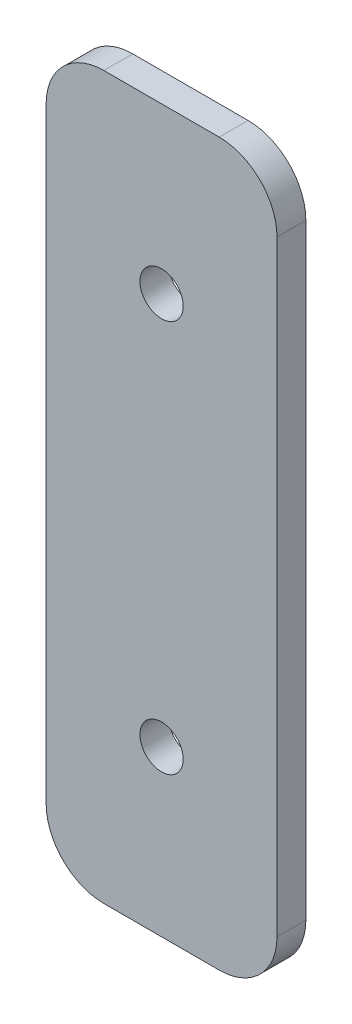
ISO-10303-21;
HEADER;
FILE_DESCRIPTION(('STEP AP214'),'2;1');
FILE_NAME('part.step','',(''),(''),'','','');
FILE_SCHEMA(('AUTOMOTIVE_DESIGN { 1 0 10303 214 1 1 1 1 }'));
ENDSEC;
DATA;
#1=APPLICATION_CONTEXT('core data for automotive mechanical design processes');
#2=APPLICATION_PROTOCOL_DEFINITION('international standard','automotive_design',2000,#1);
#3=PRODUCT_CONTEXT('',#1,'mechanical');
#4=PRODUCT('Part','Part','',(#3));
#5=PRODUCT_RELATED_PRODUCT_CATEGORY('part','',(#4));
#6=PRODUCT_DEFINITION_FORMATION('','',#4);
#7=PRODUCT_DEFINITION_CONTEXT('part definition',#1,'design');
#8=PRODUCT_DEFINITION('design','',#6,#7);
#9=PRODUCT_DEFINITION_SHAPE('','',#8);
#10=(LENGTH_UNIT() NAMED_UNIT(*) SI_UNIT(.MILLI.,.METRE.));
#11=(NAMED_UNIT(*) PLANE_ANGLE_UNIT() SI_UNIT($,.RADIAN.));
#12=(NAMED_UNIT(*) SI_UNIT($,.STERADIAN.) SOLID_ANGLE_UNIT());
#13=UNCERTAINTY_MEASURE_WITH_UNIT(LENGTH_MEASURE(1.E-05),#10,'distance_accuracy_value','');
#14=(GEOMETRIC_REPRESENTATION_CONTEXT(3) GLOBAL_UNCERTAINTY_ASSIGNED_CONTEXT((#13)) GLOBAL_UNIT_ASSIGNED_CONTEXT((#10,
#11,#12)) REPRESENTATION_CONTEXT('',''));
#15=CARTESIAN_POINT('',(0.,0.,0.));
#16=DIRECTION('',(0.,0.,1.));
#17=DIRECTION('',(1.,0.,0.));
#18=AXIS2_PLACEMENT_3D('',#15,#16,#17);
#19=CARTESIAN_POINT('',(0.,0.,5.));
#20=DIRECTION('',(0.,0.,1.));
#21=DIRECTION('',(1.,0.,0.));
#22=AXIS2_PLACEMENT_3D('',#19,#20,#21);
#23=PLANE('',#22);
#24=CARTESIAN_POINT('',(0.,34.,5.));
#25=DIRECTION('',(0.,0.,1.));
#26=DIRECTION('',(1.,0.,0.));
#27=AXIS2_PLACEMENT_3D('',#24,#25,#26);
#28=CIRCLE('',#27,3.75);
#29=CARTESIAN_POINT('',(3.75,34.,5.));
#30=VERTEX_POINT('',#29);
#31=EDGE_CURVE('E143',#30,#30,#28,.T.);
#32=ORIENTED_EDGE('',*,*,#31,.F.);
#33=EDGE_LOOP('',(#32));
#34=FACE_BOUND('',#33,.T.);
#35=DIRECTION('',(-1.,0.,0.));
#36=VECTOR('',#35,1.);
#37=CARTESIAN_POINT('',(-20.,62.5,5.));
#38=LINE('',#37,#36);
#39=CARTESIAN_POINT('',(9.99999999999999,62.5,5.));
#40=VERTEX_POINT('',#39);
#41=CARTESIAN_POINT('',(-9.99999999999999,62.5,5.));
#42=VERTEX_POINT('',#41);
#43=EDGE_CURVE('E154',#40,#42,#38,.T.);
#44=ORIENTED_EDGE('',*,*,#43,.T.);
#45=CARTESIAN_POINT('',(-9.99999999999999,52.5,5.));
#46=DIRECTION('',(0.,0.,1.));
#47=DIRECTION('',(1.,0.,0.));
#48=AXIS2_PLACEMENT_3D('',#45,#46,#47);
#49=CIRCLE('',#48,10.);
#50=CARTESIAN_POINT('',(-20.,52.5,5.));
#51=VERTEX_POINT('',#50);
#52=EDGE_CURVE('E184',#42,#51,#49,.T.);
#53=ORIENTED_EDGE('',*,*,#52,.T.);
#54=DIRECTION('',(0.,-1.,0.));
#55=VECTOR('',#54,1.);
#56=CARTESIAN_POINT('',(-20.,62.5,5.));
#57=LINE('',#56,#55);
#58=CARTESIAN_POINT('',(-20.,-52.5,5.));
#59=VERTEX_POINT('',#58);
#60=EDGE_CURVE('E133',#51,#59,#57,.T.);
#61=ORIENTED_EDGE('',*,*,#60,.T.);
#62=CARTESIAN_POINT('',(-9.99999999999999,-52.5,5.));
#63=DIRECTION('',(0.,0.,1.));
#64=DIRECTION('',(1.,0.,0.));
#65=AXIS2_PLACEMENT_3D('',#62,#63,#64);
#66=CIRCLE('',#65,10.);
#67=CARTESIAN_POINT('',(-9.99999999999999,-62.5,5.));
#68=VERTEX_POINT('',#67);
#69=EDGE_CURVE('E181',#59,#68,#66,.T.);
#70=ORIENTED_EDGE('',*,*,#69,.T.);
#71=DIRECTION('',(1.,0.,0.));
#72=VECTOR('',#71,1.);
#73=CARTESIAN_POINT('',(-20.,-62.5,5.));
#74=LINE('',#73,#72);
#75=CARTESIAN_POINT('',(9.99999999999999,-62.5,5.));
#76=VERTEX_POINT('',#75);
#77=EDGE_CURVE('E199',#68,#76,#74,.T.);
#78=ORIENTED_EDGE('',*,*,#77,.T.);
#79=CARTESIAN_POINT('',(9.99999999999999,-52.5,5.));
#80=DIRECTION('',(0.,0.,1.));
#81=DIRECTION('',(1.,0.,0.));
#82=AXIS2_PLACEMENT_3D('',#79,#80,#81);
#83=CIRCLE('',#82,10.);
#84=CARTESIAN_POINT('',(20.,-52.5,5.));
#85=VERTEX_POINT('',#84);
#86=EDGE_CURVE('E67',#76,#85,#83,.T.);
#87=ORIENTED_EDGE('',*,*,#86,.T.);
#88=DIRECTION('',(0.,1.,0.));
#89=VECTOR('',#88,1.);
#90=CARTESIAN_POINT('',(20.,62.5,5.));
#91=LINE('',#90,#89);
#92=CARTESIAN_POINT('',(20.,52.5,5.));
#93=VERTEX_POINT('',#92);
#94=EDGE_CURVE('E197',#85,#93,#91,.T.);
#95=ORIENTED_EDGE('',*,*,#94,.T.);
#96=CARTESIAN_POINT('',(9.99999999999999,52.5,5.));
#97=DIRECTION('',(0.,0.,1.));
#98=DIRECTION('',(1.,0.,0.));
#99=AXIS2_PLACEMENT_3D('',#96,#97,#98);
#100=CIRCLE('',#99,10.);
#101=EDGE_CURVE('E176',#93,#40,#100,.T.);
#102=ORIENTED_EDGE('',*,*,#101,.T.);
#103=EDGE_LOOP('',(#44,#53,#61,#70,#78,#87,#95,#102));
#104=FACE_BOUND('',#103,.T.);
#105=CARTESIAN_POINT('',(0.,-34.,5.));
#106=DIRECTION('',(0.,0.,1.));
#107=DIRECTION('',(-1.,0.,0.));
#108=AXIS2_PLACEMENT_3D('',#105,#106,#107);
#109=CIRCLE('',#108,3.75);
#110=CARTESIAN_POINT('',(-3.75,-34.,5.));
#111=VERTEX_POINT('',#110);
#112=EDGE_CURVE('E207',#111,#111,#109,.T.);
#113=ORIENTED_EDGE('',*,*,#112,.F.);
#114=EDGE_LOOP('',(#113));
#115=FACE_BOUND('',#114,.T.);
#116=ADVANCED_FACE('F45',(#34,#104,#115),#23,.T.);
#117=CARTESIAN_POINT('',(0.,0.,0.));
#118=DIRECTION('',(0.,0.,1.));
#119=DIRECTION('',(1.,0.,0.));
#120=AXIS2_PLACEMENT_3D('',#117,#118,#119);
#121=PLANE('',#120);
#122=DIRECTION('',(0.,-1.,0.));
#123=VECTOR('',#122,1.);
#124=CARTESIAN_POINT('',(-20.,62.5,0.));
#125=LINE('',#124,#123);
#126=CARTESIAN_POINT('',(-20.,52.5,0.));
#127=VERTEX_POINT('',#126);
#128=CARTESIAN_POINT('',(-20.,-52.5,0.));
#129=VERTEX_POINT('',#128);
#130=EDGE_CURVE('E130',#127,#129,#125,.T.);
#131=ORIENTED_EDGE('',*,*,#130,.F.);
#132=CARTESIAN_POINT('',(-9.99999999999999,52.5,0.));
#133=DIRECTION('',(0.,0.,1.));
#134=DIRECTION('',(1.,0.,0.));
#135=AXIS2_PLACEMENT_3D('',#132,#133,#134);
#136=CIRCLE('',#135,10.);
#137=CARTESIAN_POINT('',(-9.99999999999999,62.5,0.));
#138=VERTEX_POINT('',#137);
#139=EDGE_CURVE('E112',#127,#138,#136,.F.);
#140=ORIENTED_EDGE('',*,*,#139,.T.);
#141=DIRECTION('',(-1.,0.,0.));
#142=VECTOR('',#141,1.);
#143=CARTESIAN_POINT('',(-20.,62.5,0.));
#144=LINE('',#143,#142);
#145=CARTESIAN_POINT('',(9.99999999999999,62.5,0.));
#146=VERTEX_POINT('',#145);
#147=EDGE_CURVE('E159',#146,#138,#144,.T.);
#148=ORIENTED_EDGE('',*,*,#147,.F.);
#149=CARTESIAN_POINT('',(9.99999999999999,52.5,0.));
#150=DIRECTION('',(0.,0.,1.));
#151=DIRECTION('',(1.,0.,0.));
#152=AXIS2_PLACEMENT_3D('',#149,#150,#151);
#153=CIRCLE('',#152,10.);
#154=CARTESIAN_POINT('',(20.,52.5,0.));
#155=VERTEX_POINT('',#154);
#156=EDGE_CURVE('E135',#146,#155,#153,.F.);
#157=ORIENTED_EDGE('',*,*,#156,.T.);
#158=DIRECTION('',(0.,1.,0.));
#159=VECTOR('',#158,1.);
#160=CARTESIAN_POINT('',(20.,62.5,0.));
#161=LINE('',#160,#159);
#162=CARTESIAN_POINT('',(20.,-52.5,0.));
#163=VERTEX_POINT('',#162);
#164=EDGE_CURVE('E148',#163,#155,#161,.T.);
#165=ORIENTED_EDGE('',*,*,#164,.F.);
#166=CARTESIAN_POINT('',(9.99999999999999,-52.5,0.));
#167=DIRECTION('',(0.,0.,1.));
#168=DIRECTION('',(1.,0.,0.));
#169=AXIS2_PLACEMENT_3D('',#166,#167,#168);
#170=CIRCLE('',#169,10.);
#171=CARTESIAN_POINT('',(9.99999999999999,-62.5,0.));
#172=VERTEX_POINT('',#171);
#173=EDGE_CURVE('E166',#163,#172,#170,.F.);
#174=ORIENTED_EDGE('',*,*,#173,.T.);
#175=DIRECTION('',(1.,0.,0.));
#176=VECTOR('',#175,1.);
#177=CARTESIAN_POINT('',(-20.,-62.5,0.));
#178=LINE('',#177,#176);
#179=CARTESIAN_POINT('',(-9.99999999999999,-62.5,0.));
#180=VERTEX_POINT('',#179);
#181=EDGE_CURVE('E142',#180,#172,#178,.T.);
#182=ORIENTED_EDGE('',*,*,#181,.F.);
#183=CARTESIAN_POINT('',(-9.99999999999999,-52.5,0.));
#184=DIRECTION('',(0.,0.,1.));
#185=DIRECTION('',(1.,0.,0.));
#186=AXIS2_PLACEMENT_3D('',#183,#184,#185);
#187=CIRCLE('',#186,10.);
#188=EDGE_CURVE('E124',#180,#129,#187,.F.);
#189=ORIENTED_EDGE('',*,*,#188,.T.);
#190=EDGE_LOOP('',(#131,#140,#148,#157,#165,#174,#182,#189));
#191=FACE_BOUND('',#190,.T.);
#192=CARTESIAN_POINT('',(0.,34.,0.));
#193=DIRECTION('',(0.,0.,1.));
#194=DIRECTION('',(1.,0.,0.));
#195=AXIS2_PLACEMENT_3D('',#192,#193,#194);
#196=CIRCLE('',#195,3.75);
#197=CARTESIAN_POINT('',(3.75,34.,0.));
#198=VERTEX_POINT('',#197);
#199=EDGE_CURVE('E151',#198,#198,#196,.T.);
#200=ORIENTED_EDGE('',*,*,#199,.T.);
#201=EDGE_LOOP('',(#200));
#202=FACE_BOUND('',#201,.T.);
#203=CARTESIAN_POINT('',(0.,-34.,0.));
#204=DIRECTION('',(0.,0.,1.));
#205=DIRECTION('',(-1.,0.,0.));
#206=AXIS2_PLACEMENT_3D('',#203,#204,#205);
#207=CIRCLE('',#206,3.75);
#208=CARTESIAN_POINT('',(-3.75,-34.,0.));
#209=VERTEX_POINT('',#208);
#210=EDGE_CURVE('E209',#209,#209,#207,.T.);
#211=ORIENTED_EDGE('',*,*,#210,.T.);
#212=EDGE_LOOP('',(#211));
#213=FACE_BOUND('',#212,.T.);
#214=ADVANCED_FACE('F138',(#191,#202,#213),#121,.F.);
#215=CARTESIAN_POINT('',(-20.,62.5,5.));
#216=DIRECTION('',(1.,0.,0.));
#217=DIRECTION('',(0.,0.,-1.));
#218=AXIS2_PLACEMENT_3D('',#215,#216,#217);
#219=PLANE('',#218);
#220=ORIENTED_EDGE('',*,*,#60,.F.);
#221=DIRECTION('',(0.,0.,-1.));
#222=VECTOR('',#221,1.);
#223=CARTESIAN_POINT('',(-20.,52.5,5.));
#224=LINE('',#223,#222);
#225=EDGE_CURVE('E116',#51,#127,#224,.T.);
#226=ORIENTED_EDGE('',*,*,#225,.T.);
#227=ORIENTED_EDGE('',*,*,#130,.T.);
#228=DIRECTION('',(0.,0.,-1.));
#229=VECTOR('',#228,1.);
#230=CARTESIAN_POINT('',(-20.,-52.5,5.));
#231=LINE('',#230,#229);
#232=EDGE_CURVE('E136',#129,#59,#231,.F.);
#233=ORIENTED_EDGE('',*,*,#232,.T.);
#234=EDGE_LOOP('',(#220,#226,#227,#233));
#235=FACE_BOUND('',#234,.T.);
#236=ADVANCED_FACE('F129',(#235),#219,.F.);
#237=CARTESIAN_POINT('',(-20.,-62.5,5.));
#238=DIRECTION('',(0.,1.,0.));
#239=DIRECTION('',(0.,0.,1.));
#240=AXIS2_PLACEMENT_3D('',#237,#238,#239);
#241=PLANE('',#240);
#242=ORIENTED_EDGE('',*,*,#77,.F.);
#243=DIRECTION('',(0.,0.,-1.));
#244=VECTOR('',#243,1.);
#245=CARTESIAN_POINT('',(-9.99999999999999,-62.5,5.));
#246=LINE('',#245,#244);
#247=EDGE_CURVE('E190',#68,#180,#246,.T.);
#248=ORIENTED_EDGE('',*,*,#247,.T.);
#249=ORIENTED_EDGE('',*,*,#181,.T.);
#250=DIRECTION('',(0.,0.,-1.));
#251=VECTOR('',#250,1.);
#252=CARTESIAN_POINT('',(9.99999999999999,-62.5,5.));
#253=LINE('',#252,#251);
#254=EDGE_CURVE('E187',#172,#76,#253,.F.);
#255=ORIENTED_EDGE('',*,*,#254,.T.);
#256=EDGE_LOOP('',(#242,#248,#249,#255));
#257=FACE_BOUND('',#256,.T.);
#258=ADVANCED_FACE('F239',(#257),#241,.F.);
#259=CARTESIAN_POINT('',(20.,62.5,5.));
#260=DIRECTION('',(-1.,0.,0.));
#261=DIRECTION('',(0.,0.,1.));
#262=AXIS2_PLACEMENT_3D('',#259,#260,#261);
#263=PLANE('',#262);
#264=ORIENTED_EDGE('',*,*,#94,.F.);
#265=DIRECTION('',(0.,0.,-1.));
#266=VECTOR('',#265,1.);
#267=CARTESIAN_POINT('',(20.,-52.5,5.));
#268=LINE('',#267,#266);
#269=EDGE_CURVE('E11',#85,#163,#268,.T.);
#270=ORIENTED_EDGE('',*,*,#269,.T.);
#271=ORIENTED_EDGE('',*,*,#164,.T.);
#272=DIRECTION('',(0.,0.,-1.));
#273=VECTOR('',#272,1.);
#274=CARTESIAN_POINT('',(20.,52.5,5.));
#275=LINE('',#274,#273);
#276=EDGE_CURVE('E54',#155,#93,#275,.F.);
#277=ORIENTED_EDGE('',*,*,#276,.T.);
#278=EDGE_LOOP('',(#264,#270,#271,#277));
#279=FACE_BOUND('',#278,.T.);
#280=ADVANCED_FACE('F235',(#279),#263,.F.);
#281=CARTESIAN_POINT('',(-20.,62.5,5.));
#282=DIRECTION('',(0.,-1.,0.));
#283=DIRECTION('',(0.,0.,-1.));
#284=AXIS2_PLACEMENT_3D('',#281,#282,#283);
#285=PLANE('',#284);
#286=ORIENTED_EDGE('',*,*,#147,.T.);
#287=DIRECTION('',(0.,0.,-1.));
#288=VECTOR('',#287,1.);
#289=CARTESIAN_POINT('',(-9.99999999999999,62.5,5.));
#290=LINE('',#289,#288);
#291=EDGE_CURVE('E117',#138,#42,#290,.F.);
#292=ORIENTED_EDGE('',*,*,#291,.T.);
#293=ORIENTED_EDGE('',*,*,#43,.F.);
#294=DIRECTION('',(0.,0.,-1.));
#295=VECTOR('',#294,1.);
#296=CARTESIAN_POINT('',(9.99999999999999,62.5,5.));
#297=LINE('',#296,#295);
#298=EDGE_CURVE('E123',#40,#146,#297,.T.);
#299=ORIENTED_EDGE('',*,*,#298,.T.);
#300=EDGE_LOOP('',(#286,#292,#293,#299));
#301=FACE_BOUND('',#300,.T.);
#302=ADVANCED_FACE('F232',(#301),#285,.F.);
#303=CARTESIAN_POINT('',(0.,34.,5.));
#304=DIRECTION('',(0.,0.,-1.));
#305=DIRECTION('',(-1.,0.,0.));
#306=AXIS2_PLACEMENT_3D('',#303,#304,#305);
#307=CYLINDRICAL_SURFACE('',#306,3.75);
#308=ORIENTED_EDGE('',*,*,#31,.T.);
#309=EDGE_LOOP('',(#308));
#310=FACE_BOUND('',#309,.T.);
#311=ORIENTED_EDGE('',*,*,#199,.F.);
#312=EDGE_LOOP('',(#311));
#313=FACE_BOUND('',#312,.T.);
#314=ADVANCED_FACE('F229',(#310,#313),#307,.F.);
#315=CARTESIAN_POINT('',(0.,-34.,5.));
#316=DIRECTION('',(0.,0.,-1.));
#317=DIRECTION('',(-1.,0.,0.));
#318=AXIS2_PLACEMENT_3D('',#315,#316,#317);
#319=CYLINDRICAL_SURFACE('',#318,3.75);
#320=ORIENTED_EDGE('',*,*,#112,.T.);
#321=EDGE_LOOP('',(#320));
#322=FACE_BOUND('',#321,.T.);
#323=ORIENTED_EDGE('',*,*,#210,.F.);
#324=EDGE_LOOP('',(#323));
#325=FACE_BOUND('',#324,.T.);
#326=ADVANCED_FACE('F217',(#322,#325),#319,.F.);
#327=CARTESIAN_POINT('',(-9.99999999999999,52.5,5.));
#328=DIRECTION('',(0.,0.,-1.));
#329=DIRECTION('',(-1.,0.,0.));
#330=AXIS2_PLACEMENT_3D('',#327,#328,#329);
#331=CYLINDRICAL_SURFACE('',#330,10.);
#332=ORIENTED_EDGE('',*,*,#52,.F.);
#333=ORIENTED_EDGE('',*,*,#291,.F.);
#334=ORIENTED_EDGE('',*,*,#139,.F.);
#335=ORIENTED_EDGE('',*,*,#225,.F.);
#336=EDGE_LOOP('',(#332,#333,#334,#335));
#337=FACE_BOUND('',#336,.T.);
#338=ADVANCED_FACE('F115',(#337),#331,.T.);
#339=CARTESIAN_POINT('',(-9.99999999999999,-52.5,5.));
#340=DIRECTION('',(0.,0.,-1.));
#341=DIRECTION('',(-1.,0.,0.));
#342=AXIS2_PLACEMENT_3D('',#339,#340,#341);
#343=CYLINDRICAL_SURFACE('',#342,10.);
#344=ORIENTED_EDGE('',*,*,#69,.F.);
#345=ORIENTED_EDGE('',*,*,#232,.F.);
#346=ORIENTED_EDGE('',*,*,#188,.F.);
#347=ORIENTED_EDGE('',*,*,#247,.F.);
#348=EDGE_LOOP('',(#344,#345,#346,#347));
#349=FACE_BOUND('',#348,.T.);
#350=ADVANCED_FACE('F247',(#349),#343,.T.);
#351=CARTESIAN_POINT('',(9.99999999999999,-52.5,5.));
#352=DIRECTION('',(0.,0.,-1.));
#353=DIRECTION('',(-1.,0.,0.));
#354=AXIS2_PLACEMENT_3D('',#351,#352,#353);
#355=CYLINDRICAL_SURFACE('',#354,10.);
#356=ORIENTED_EDGE('',*,*,#86,.F.);
#357=ORIENTED_EDGE('',*,*,#254,.F.);
#358=ORIENTED_EDGE('',*,*,#173,.F.);
#359=ORIENTED_EDGE('',*,*,#269,.F.);
#360=EDGE_LOOP('',(#356,#357,#358,#359));
#361=FACE_BOUND('',#360,.T.);
#362=ADVANCED_FACE('F249',(#361),#355,.T.);
#363=CARTESIAN_POINT('',(9.99999999999999,52.5,5.));
#364=DIRECTION('',(0.,0.,-1.));
#365=DIRECTION('',(-1.,0.,0.));
#366=AXIS2_PLACEMENT_3D('',#363,#364,#365);
#367=CYLINDRICAL_SURFACE('',#366,10.);
#368=ORIENTED_EDGE('',*,*,#101,.F.);
#369=ORIENTED_EDGE('',*,*,#276,.F.);
#370=ORIENTED_EDGE('',*,*,#156,.F.);
#371=ORIENTED_EDGE('',*,*,#298,.F.);
#372=EDGE_LOOP('',(#368,#369,#370,#371));
#373=FACE_BOUND('',#372,.T.);
#374=ADVANCED_FACE('F47',(#373),#367,.T.);
#375=CLOSED_SHELL('',(#116,#214,#236,#258,#280,#302,#314,#326,#338,#350,#362,#374));
#376=MANIFOLD_SOLID_BREP('B2',#375);
#377=ADVANCED_BREP_SHAPE_REPRESENTATION('',(#18,#376),#14);
#378=SHAPE_DEFINITION_REPRESENTATION(#9,#377);
ENDSEC;
END-ISO-10303-21;
